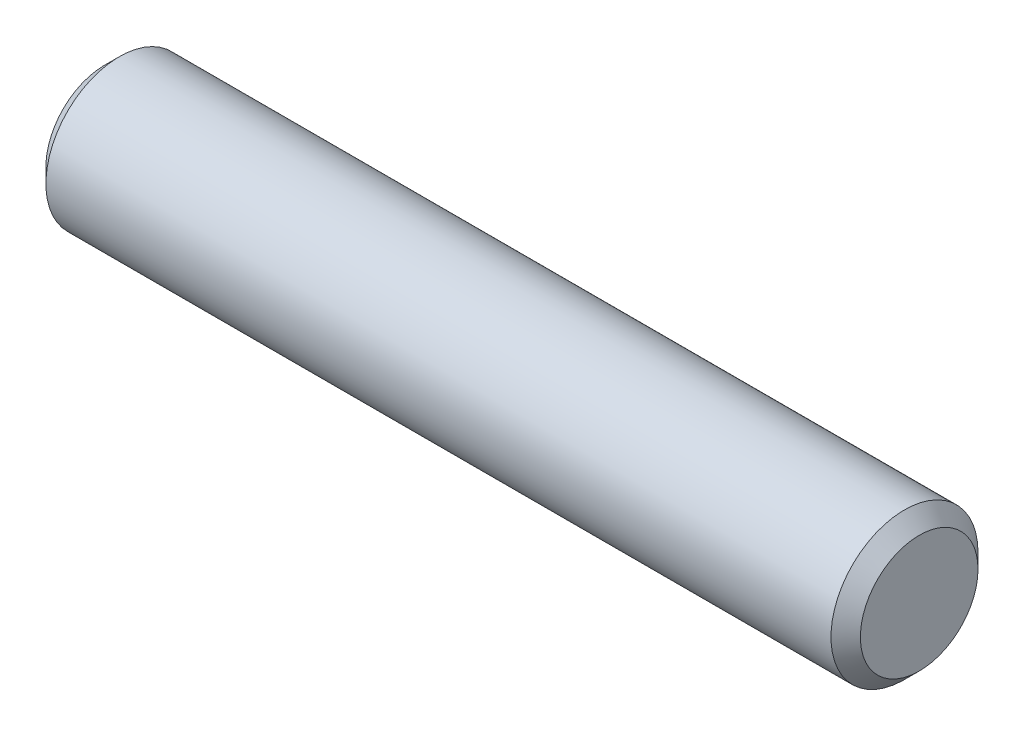
ISO-10303-21;
HEADER;
FILE_DESCRIPTION(('STEP AP214'),'2;1');
FILE_NAME('part.step','',(''),(''),'','','');
FILE_SCHEMA(('AUTOMOTIVE_DESIGN { 1 0 10303 214 1 1 1 1 }'));
ENDSEC;
DATA;
#1=APPLICATION_CONTEXT('core data for automotive mechanical design processes');
#2=APPLICATION_PROTOCOL_DEFINITION('international standard','automotive_design',2000,#1);
#3=PRODUCT_CONTEXT('',#1,'mechanical');
#4=PRODUCT('Part','Part','',(#3));
#5=PRODUCT_RELATED_PRODUCT_CATEGORY('part','',(#4));
#6=PRODUCT_DEFINITION_FORMATION('','',#4);
#7=PRODUCT_DEFINITION_CONTEXT('part definition',#1,'design');
#8=PRODUCT_DEFINITION('design','',#6,#7);
#9=PRODUCT_DEFINITION_SHAPE('','',#8);
#10=(LENGTH_UNIT() NAMED_UNIT(*) SI_UNIT(.MILLI.,.METRE.));
#11=(NAMED_UNIT(*) PLANE_ANGLE_UNIT() SI_UNIT($,.RADIAN.));
#12=(NAMED_UNIT(*) SI_UNIT($,.STERADIAN.) SOLID_ANGLE_UNIT());
#13=UNCERTAINTY_MEASURE_WITH_UNIT(LENGTH_MEASURE(1.E-05),#10,'distance_accuracy_value','');
#14=(GEOMETRIC_REPRESENTATION_CONTEXT(3) GLOBAL_UNCERTAINTY_ASSIGNED_CONTEXT((#13)) GLOBAL_UNIT_ASSIGNED_CONTEXT((#10,
#11,#12)) REPRESENTATION_CONTEXT('',''));
#15=CARTESIAN_POINT('',(0.,0.,0.));
#16=DIRECTION('',(0.,0.,1.));
#17=DIRECTION('',(1.,0.,0.));
#18=AXIS2_PLACEMENT_3D('',#15,#16,#17);
#19=CARTESIAN_POINT('',(55.4,0.,0.));
#20=DIRECTION('',(-1.,0.,0.));
#21=DIRECTION('',(0.,0.,1.));
#22=AXIS2_PLACEMENT_3D('',#19,#20,#21);
#23=CYLINDRICAL_SURFACE('',#22,5.);
#24=CARTESIAN_POINT('',(54.4,0.,0.));
#25=DIRECTION('',(1.,0.,0.));
#26=DIRECTION('',(0.,0.,-1.));
#27=AXIS2_PLACEMENT_3D('',#24,#25,#26);
#28=CIRCLE('',#27,5.);
#29=CARTESIAN_POINT('',(54.4,0.,-5.));
#30=VERTEX_POINT('',#29);
#31=EDGE_CURVE('E47',#30,#30,#28,.F.);
#32=ORIENTED_EDGE('',*,*,#31,.T.);
#33=EDGE_LOOP('',(#32));
#34=FACE_BOUND('',#33,.T.);
#35=CARTESIAN_POINT('',(1.00000000000002,0.,0.));
#36=DIRECTION('',(1.,0.,0.));
#37=DIRECTION('',(0.,0.,-1.));
#38=AXIS2_PLACEMENT_3D('',#35,#36,#37);
#39=CIRCLE('',#38,5.);
#40=CARTESIAN_POINT('',(1.00000000000002,0.,-5.));
#41=VERTEX_POINT('',#40);
#42=EDGE_CURVE('E51',#41,#41,#39,.T.);
#43=ORIENTED_EDGE('',*,*,#42,.T.);
#44=EDGE_LOOP('',(#43));
#45=FACE_BOUND('',#44,.T.);
#46=ADVANCED_FACE('F39',(#34,#45),#23,.T.);
#47=CARTESIAN_POINT('',(55.4,0.,0.));
#48=DIRECTION('',(1.,0.,0.));
#49=DIRECTION('',(0.,0.,-1.));
#50=AXIS2_PLACEMENT_3D('',#47,#48,#49);
#51=PLANE('',#50);
#52=CARTESIAN_POINT('',(55.4,0.,0.));
#53=DIRECTION('',(1.,0.,0.));
#54=DIRECTION('',(0.,0.,-1.));
#55=AXIS2_PLACEMENT_3D('',#52,#53,#54);
#56=CIRCLE('',#55,3.99999999999999);
#57=CARTESIAN_POINT('',(55.4,0.,-3.99999999999999));
#58=VERTEX_POINT('',#57);
#59=EDGE_CURVE('E55',#58,#58,#56,.T.);
#60=ORIENTED_EDGE('',*,*,#59,.T.);
#61=EDGE_LOOP('',(#60));
#62=FACE_BOUND('',#61,.T.);
#63=ADVANCED_FACE('F61',(#62),#51,.T.);
#64=CARTESIAN_POINT('',(0.,0.,0.));
#65=DIRECTION('',(1.,0.,0.));
#66=DIRECTION('',(0.,0.,-1.));
#67=AXIS2_PLACEMENT_3D('',#64,#65,#66);
#68=PLANE('',#67);
#69=CARTESIAN_POINT('',(0.,0.,0.));
#70=DIRECTION('',(1.,0.,0.));
#71=DIRECTION('',(0.,0.,-1.));
#72=AXIS2_PLACEMENT_3D('',#69,#70,#71);
#73=CIRCLE('',#72,3.99999999999998);
#74=CARTESIAN_POINT('',(0.,0.,-3.99999999999998));
#75=VERTEX_POINT('',#74);
#76=EDGE_CURVE('E10',#75,#75,#73,.F.);
#77=ORIENTED_EDGE('',*,*,#76,.T.);
#78=EDGE_LOOP('',(#77));
#79=FACE_BOUND('',#78,.T.);
#80=ADVANCED_FACE('F65',(#79),#68,.F.);
#81=CARTESIAN_POINT('',(55.4,0.,0.));
#82=DIRECTION('',(-1.,0.,0.));
#83=DIRECTION('',(0.,0.,1.));
#84=AXIS2_PLACEMENT_3D('',#81,#82,#83);
#85=CONICAL_SURFACE('',#84,3.99999999999999,0.785398163397442);
#86=ORIENTED_EDGE('',*,*,#31,.F.);
#87=EDGE_LOOP('',(#86));
#88=FACE_BOUND('',#87,.T.);
#89=ORIENTED_EDGE('',*,*,#59,.F.);
#90=EDGE_LOOP('',(#89));
#91=FACE_BOUND('',#90,.T.);
#92=ADVANCED_FACE('F63',(#88,#91),#85,.T.);
#93=CARTESIAN_POINT('',(1.00000000000002,0.,0.));
#94=DIRECTION('',(1.,0.,0.));
#95=DIRECTION('',(0.,0.,-1.));
#96=AXIS2_PLACEMENT_3D('',#93,#94,#95);
#97=CONICAL_SURFACE('',#96,5.,0.785398163397449);
#98=ORIENTED_EDGE('',*,*,#76,.F.);
#99=EDGE_LOOP('',(#98));
#100=FACE_BOUND('',#99,.T.);
#101=ORIENTED_EDGE('',*,*,#42,.F.);
#102=EDGE_LOOP('',(#101));
#103=FACE_BOUND('',#102,.T.);
#104=ADVANCED_FACE('F42',(#100,#103),#97,.T.);
#105=CLOSED_SHELL('',(#46,#63,#80,#92,#104));
#106=MANIFOLD_SOLID_BREP('B2',#105);
#107=ADVANCED_BREP_SHAPE_REPRESENTATION('',(#18,#106),#14);
#108=SHAPE_DEFINITION_REPRESENTATION(#9,#107);
ENDSEC;
END-ISO-10303-21;
